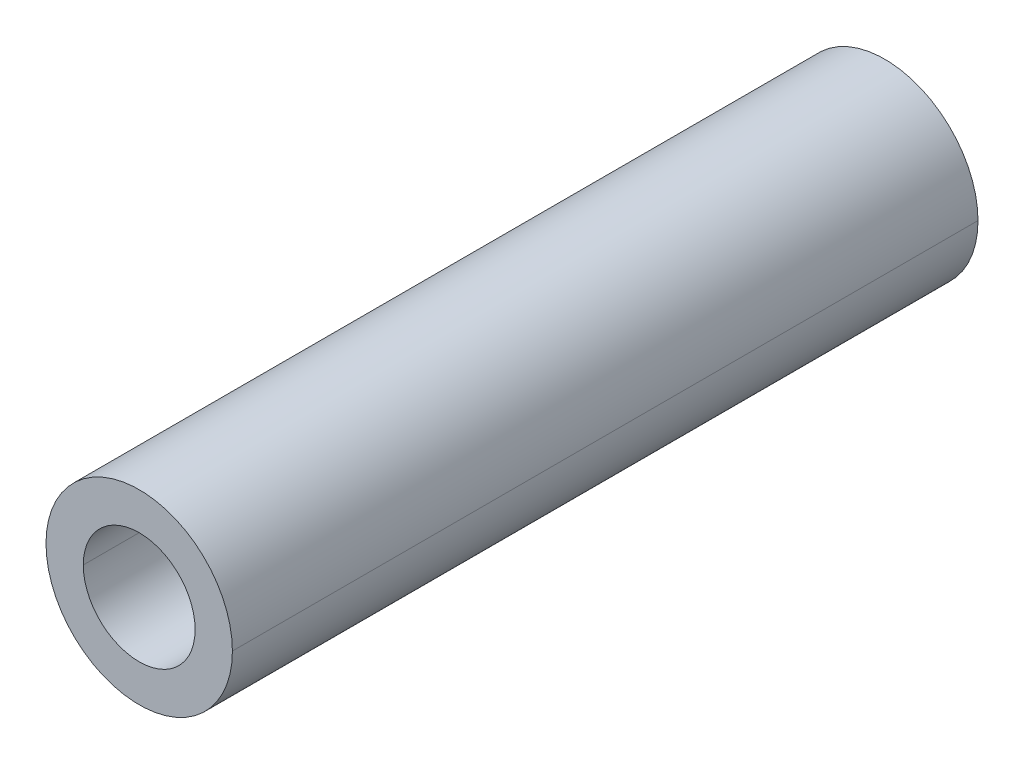
ISO-10303-21;
HEADER;
FILE_DESCRIPTION(('STEP AP214'),'2;1');
FILE_NAME('part.step','',(''),(''),'','','');
FILE_SCHEMA(('AUTOMOTIVE_DESIGN { 1 0 10303 214 1 1 1 1 }'));
ENDSEC;
DATA;
#1=APPLICATION_CONTEXT('core data for automotive mechanical design processes');
#2=APPLICATION_PROTOCOL_DEFINITION('international standard','automotive_design',2000,#1);
#3=PRODUCT_CONTEXT('',#1,'mechanical');
#4=PRODUCT('Part','Part','',(#3));
#5=PRODUCT_RELATED_PRODUCT_CATEGORY('part','',(#4));
#6=PRODUCT_DEFINITION_FORMATION('','',#4);
#7=PRODUCT_DEFINITION_CONTEXT('part definition',#1,'design');
#8=PRODUCT_DEFINITION('design','',#6,#7);
#9=PRODUCT_DEFINITION_SHAPE('','',#8);
#10=(LENGTH_UNIT() NAMED_UNIT(*) SI_UNIT(.MILLI.,.METRE.));
#11=(NAMED_UNIT(*) PLANE_ANGLE_UNIT() SI_UNIT($,.RADIAN.));
#12=(NAMED_UNIT(*) SI_UNIT($,.STERADIAN.) SOLID_ANGLE_UNIT());
#13=UNCERTAINTY_MEASURE_WITH_UNIT(LENGTH_MEASURE(1.E-05),#10,'distance_accuracy_value','');
#14=(GEOMETRIC_REPRESENTATION_CONTEXT(3) GLOBAL_UNCERTAINTY_ASSIGNED_CONTEXT((#13)) GLOBAL_UNIT_ASSIGNED_CONTEXT((#10,
#11,#12)) REPRESENTATION_CONTEXT('',''));
#15=CARTESIAN_POINT('',(0.,0.,0.));
#16=DIRECTION('',(0.,0.,1.));
#17=DIRECTION('',(1.,0.,0.));
#18=AXIS2_PLACEMENT_3D('',#15,#16,#17);
#19=CARTESIAN_POINT('',(0.,0.,20.));
#20=DIRECTION('',(0.,0.,-1.));
#21=DIRECTION('',(-1.,0.,0.));
#22=AXIS2_PLACEMENT_3D('',#19,#20,#21);
#23=CYLINDRICAL_SURFACE('',#22,1.5);
#24=DIRECTION('',(0.,0.,-1.));
#25=VECTOR('',#24,1.);
#26=CARTESIAN_POINT('',(1.5,0.,20.));
#27=LINE('',#26,#25);
#28=CARTESIAN_POINT('',(1.5,0.,20.));
#29=VERTEX_POINT('',#28);
#30=CARTESIAN_POINT('',(1.5,0.,0.));
#31=VERTEX_POINT('',#30);
#32=EDGE_CURVE('E84',#29,#31,#27,.T.);
#33=ORIENTED_EDGE('',*,*,#32,.F.);
#34=CARTESIAN_POINT('',(0.,0.,20.));
#35=DIRECTION('',(0.,0.,1.));
#36=DIRECTION('',(1.,0.,0.));
#37=AXIS2_PLACEMENT_3D('',#34,#35,#36);
#38=CIRCLE('',#37,1.5);
#39=CARTESIAN_POINT('',(-1.5,0.,20.));
#40=VERTEX_POINT('',#39);
#41=EDGE_CURVE('E77',#29,#40,#38,.T.);
#42=ORIENTED_EDGE('',*,*,#41,.T.);
#43=DIRECTION('',(0.,0.,-1.));
#44=VECTOR('',#43,1.);
#45=CARTESIAN_POINT('',(-1.5,0.,20.));
#46=LINE('',#45,#44);
#47=CARTESIAN_POINT('',(-1.5,0.,0.));
#48=VERTEX_POINT('',#47);
#49=EDGE_CURVE('E75',#40,#48,#46,.T.);
#50=ORIENTED_EDGE('',*,*,#49,.T.);
#51=CARTESIAN_POINT('',(0.,0.,0.));
#52=DIRECTION('',(0.,0.,1.));
#53=DIRECTION('',(1.,0.,0.));
#54=AXIS2_PLACEMENT_3D('',#51,#52,#53);
#55=CIRCLE('',#54,1.5);
#56=EDGE_CURVE('E11',#31,#48,#55,.T.);
#57=ORIENTED_EDGE('',*,*,#56,.F.);
#58=EDGE_LOOP('',(#33,#42,#50,#57));
#59=FACE_BOUND('',#58,.T.);
#60=ADVANCED_FACE('F17',(#59),#23,.F.);
#61=CARTESIAN_POINT('',(0.,0.,20.));
#62=DIRECTION('',(0.,0.,-1.));
#63=DIRECTION('',(-1.,0.,0.));
#64=AXIS2_PLACEMENT_3D('',#61,#62,#63);
#65=CYLINDRICAL_SURFACE('',#64,2.5);
#66=DIRECTION('',(0.,0.,-1.));
#67=VECTOR('',#66,1.);
#68=CARTESIAN_POINT('',(2.5,0.,20.));
#69=LINE('',#68,#67);
#70=CARTESIAN_POINT('',(2.5,0.,20.));
#71=VERTEX_POINT('',#70);
#72=CARTESIAN_POINT('',(2.5,0.,0.));
#73=VERTEX_POINT('',#72);
#74=EDGE_CURVE('E99',#71,#73,#69,.T.);
#75=ORIENTED_EDGE('',*,*,#74,.F.);
#76=CARTESIAN_POINT('',(0.,0.,20.));
#77=DIRECTION('',(0.,0.,1.));
#78=DIRECTION('',(1.,0.,0.));
#79=AXIS2_PLACEMENT_3D('',#76,#77,#78);
#80=CIRCLE('',#79,2.5);
#81=CARTESIAN_POINT('',(-2.5,0.,20.));
#82=VERTEX_POINT('',#81);
#83=EDGE_CURVE('E96',#82,#71,#80,.T.);
#84=ORIENTED_EDGE('',*,*,#83,.F.);
#85=DIRECTION('',(0.,0.,-1.));
#86=VECTOR('',#85,1.);
#87=CARTESIAN_POINT('',(-2.5,0.,20.));
#88=LINE('',#87,#86);
#89=CARTESIAN_POINT('',(-2.5,0.,0.));
#90=VERTEX_POINT('',#89);
#91=EDGE_CURVE('E106',#82,#90,#88,.T.);
#92=ORIENTED_EDGE('',*,*,#91,.T.);
#93=CARTESIAN_POINT('',(0.,0.,0.));
#94=DIRECTION('',(0.,0.,1.));
#95=DIRECTION('',(1.,0.,0.));
#96=AXIS2_PLACEMENT_3D('',#93,#94,#95);
#97=CIRCLE('',#96,2.5);
#98=EDGE_CURVE('E28',#90,#73,#97,.T.);
#99=ORIENTED_EDGE('',*,*,#98,.T.);
#100=EDGE_LOOP('',(#75,#84,#92,#99));
#101=FACE_BOUND('',#100,.T.);
#102=ADVANCED_FACE('F121',(#101),#65,.T.);
#103=CARTESIAN_POINT('',(0.,0.,0.));
#104=DIRECTION('',(0.,0.,1.));
#105=DIRECTION('',(1.,0.,0.));
#106=AXIS2_PLACEMENT_3D('',#103,#104,#105);
#107=PLANE('',#106);
#108=CARTESIAN_POINT('',(0.,0.,0.));
#109=DIRECTION('',(0.,0.,1.));
#110=DIRECTION('',(1.,0.,0.));
#111=AXIS2_PLACEMENT_3D('',#108,#109,#110);
#112=CIRCLE('',#111,1.5);
#113=EDGE_CURVE('E70',#48,#31,#112,.T.);
#114=ORIENTED_EDGE('',*,*,#113,.T.);
#115=ORIENTED_EDGE('',*,*,#56,.T.);
#116=EDGE_LOOP('',(#114,#115));
#117=FACE_BOUND('',#116,.T.);
#118=ORIENTED_EDGE('',*,*,#98,.F.);
#119=CARTESIAN_POINT('',(0.,0.,0.));
#120=DIRECTION('',(0.,0.,1.));
#121=DIRECTION('',(1.,0.,0.));
#122=AXIS2_PLACEMENT_3D('',#119,#120,#121);
#123=CIRCLE('',#122,2.5);
#124=EDGE_CURVE('E103',#73,#90,#123,.T.);
#125=ORIENTED_EDGE('',*,*,#124,.F.);
#126=EDGE_LOOP('',(#118,#125));
#127=FACE_BOUND('',#126,.T.);
#128=ADVANCED_FACE('F68',(#117,#127),#107,.F.);
#129=CARTESIAN_POINT('',(0.,0.,20.));
#130=DIRECTION('',(0.,0.,1.));
#131=DIRECTION('',(1.,0.,0.));
#132=AXIS2_PLACEMENT_3D('',#129,#130,#131);
#133=PLANE('',#132);
#134=CARTESIAN_POINT('',(0.,0.,20.));
#135=DIRECTION('',(0.,0.,1.));
#136=DIRECTION('',(1.,0.,0.));
#137=AXIS2_PLACEMENT_3D('',#134,#135,#136);
#138=CIRCLE('',#137,1.5);
#139=EDGE_CURVE('E92',#40,#29,#138,.T.);
#140=ORIENTED_EDGE('',*,*,#139,.F.);
#141=ORIENTED_EDGE('',*,*,#41,.F.);
#142=EDGE_LOOP('',(#140,#141));
#143=FACE_BOUND('',#142,.T.);
#144=ORIENTED_EDGE('',*,*,#83,.T.);
#145=CARTESIAN_POINT('',(0.,0.,20.));
#146=DIRECTION('',(0.,0.,1.));
#147=DIRECTION('',(1.,0.,0.));
#148=AXIS2_PLACEMENT_3D('',#145,#146,#147);
#149=CIRCLE('',#148,2.5);
#150=EDGE_CURVE('E21',#71,#82,#149,.T.);
#151=ORIENTED_EDGE('',*,*,#150,.T.);
#152=EDGE_LOOP('',(#144,#151));
#153=FACE_BOUND('',#152,.T.);
#154=ADVANCED_FACE('F19',(#143,#153),#133,.T.);
#155=CARTESIAN_POINT('',(0.,0.,20.));
#156=DIRECTION('',(0.,0.,-1.));
#157=DIRECTION('',(-1.,0.,0.));
#158=AXIS2_PLACEMENT_3D('',#155,#156,#157);
#159=CYLINDRICAL_SURFACE('',#158,2.5);
#160=ORIENTED_EDGE('',*,*,#150,.F.);
#161=ORIENTED_EDGE('',*,*,#74,.T.);
#162=ORIENTED_EDGE('',*,*,#124,.T.);
#163=ORIENTED_EDGE('',*,*,#91,.F.);
#164=EDGE_LOOP('',(#160,#161,#162,#163));
#165=FACE_BOUND('',#164,.T.);
#166=ADVANCED_FACE('F124',(#165),#159,.T.);
#167=CARTESIAN_POINT('',(0.,0.,20.));
#168=DIRECTION('',(0.,0.,-1.));
#169=DIRECTION('',(-1.,0.,0.));
#170=AXIS2_PLACEMENT_3D('',#167,#168,#169);
#171=CYLINDRICAL_SURFACE('',#170,1.5);
#172=ORIENTED_EDGE('',*,*,#139,.T.);
#173=ORIENTED_EDGE('',*,*,#32,.T.);
#174=ORIENTED_EDGE('',*,*,#113,.F.);
#175=ORIENTED_EDGE('',*,*,#49,.F.);
#176=EDGE_LOOP('',(#172,#173,#174,#175));
#177=FACE_BOUND('',#176,.T.);
#178=ADVANCED_FACE('F83',(#177),#171,.F.);
#179=CLOSED_SHELL('',(#60,#102,#128,#154,#166,#178));
#180=MANIFOLD_SOLID_BREP('B1',#179);
#181=ADVANCED_BREP_SHAPE_REPRESENTATION('',(#18,#180),#14);
#182=SHAPE_DEFINITION_REPRESENTATION(#9,#181);
ENDSEC;
END-ISO-10303-21;
